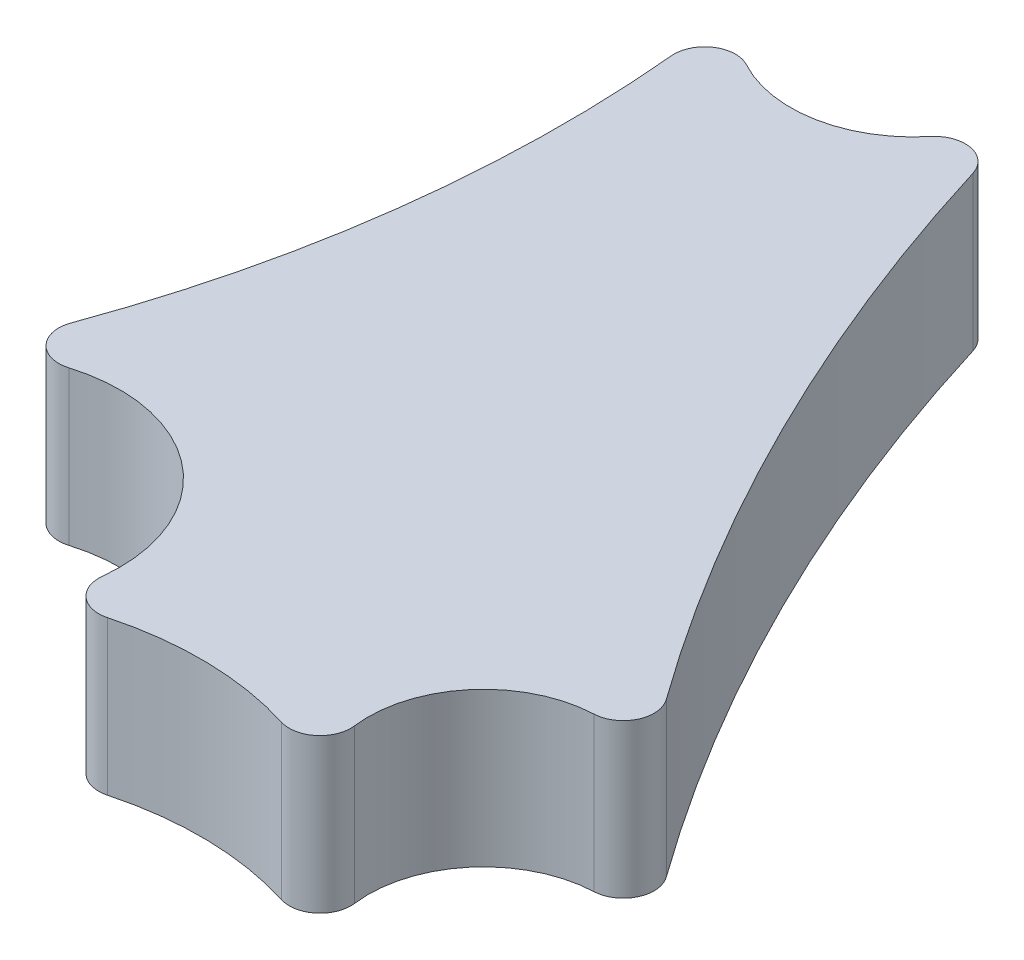
ISO-10303-21;
HEADER;
FILE_DESCRIPTION(('STEP AP214'),'2;1');
FILE_NAME('part.step','',(''),(''),'','','');
FILE_SCHEMA(('AUTOMOTIVE_DESIGN { 1 0 10303 214 1 1 1 1 }'));
ENDSEC;
DATA;
#1=APPLICATION_CONTEXT('core data for automotive mechanical design processes');
#2=APPLICATION_PROTOCOL_DEFINITION('international standard','automotive_design',2000,#1);
#3=PRODUCT_CONTEXT('',#1,'mechanical');
#4=PRODUCT('Part','Part','',(#3));
#5=PRODUCT_RELATED_PRODUCT_CATEGORY('part','',(#4));
#6=PRODUCT_DEFINITION_FORMATION('','',#4);
#7=PRODUCT_DEFINITION_CONTEXT('part definition',#1,'design');
#8=PRODUCT_DEFINITION('design','',#6,#7);
#9=PRODUCT_DEFINITION_SHAPE('','',#8);
#10=(LENGTH_UNIT() NAMED_UNIT(*) SI_UNIT(.MILLI.,.METRE.));
#11=(NAMED_UNIT(*) PLANE_ANGLE_UNIT() SI_UNIT($,.RADIAN.));
#12=(NAMED_UNIT(*) SI_UNIT($,.STERADIAN.) SOLID_ANGLE_UNIT());
#13=UNCERTAINTY_MEASURE_WITH_UNIT(LENGTH_MEASURE(1.E-05),#10,'distance_accuracy_value','');
#14=(GEOMETRIC_REPRESENTATION_CONTEXT(3) GLOBAL_UNCERTAINTY_ASSIGNED_CONTEXT((#13)) GLOBAL_UNIT_ASSIGNED_CONTEXT((#10,
#11,#12)) REPRESENTATION_CONTEXT('',''));
#15=CARTESIAN_POINT('',(0.,0.,0.));
#16=DIRECTION('',(0.,0.,1.));
#17=DIRECTION('',(1.,0.,0.));
#18=AXIS2_PLACEMENT_3D('',#15,#16,#17);
#19=CARTESIAN_POINT('',(0.,12.7,0.));
#20=DIRECTION('',(0.,-1.,0.));
#21=DIRECTION('',(0.,0.,-1.));
#22=AXIS2_PLACEMENT_3D('',#19,#20,#21);
#23=CYLINDRICAL_SURFACE('',#22,12.7);
#24=CARTESIAN_POINT('',(0.,0.,0.));
#25=DIRECTION('',(0.,1.,0.));
#26=DIRECTION('',(0.,0.,1.));
#27=AXIS2_PLACEMENT_3D('',#24,#25,#26);
#28=CIRCLE('',#27,12.7);
#29=CARTESIAN_POINT('',(12.6249154529566,0.,1.37895243054242));
#30=VERTEX_POINT('',#29);
#31=CARTESIAN_POINT('',(-3.66399168199355,0.,-12.1599821115938));
#32=VERTEX_POINT('',#31);
#33=EDGE_CURVE('E261',#30,#32,#28,.T.);
#34=ORIENTED_EDGE('',*,*,#33,.F.);
#35=DIRECTION('',(0.,-1.,0.));
#36=VECTOR('',#35,1.);
#37=CARTESIAN_POINT('',(12.6249154529566,12.7,1.37895243054242));
#38=LINE('',#37,#36);
#39=CARTESIAN_POINT('',(12.6249154529566,12.7,1.37895243054242));
#40=VERTEX_POINT('',#39);
#41=EDGE_CURVE('E223',#30,#40,#38,.F.);
#42=ORIENTED_EDGE('',*,*,#41,.T.);
#43=CARTESIAN_POINT('',(0.,12.7,0.));
#44=DIRECTION('',(0.,1.,0.));
#45=DIRECTION('',(0.,0.,1.));
#46=AXIS2_PLACEMENT_3D('',#43,#44,#45);
#47=CIRCLE('',#46,12.7);
#48=CARTESIAN_POINT('',(-3.66399168199355,12.7,-12.1599821115938));
#49=VERTEX_POINT('',#48);
#50=EDGE_CURVE('E247',#40,#49,#47,.T.);
#51=ORIENTED_EDGE('',*,*,#50,.T.);
#52=DIRECTION('',(0.,-1.,0.));
#53=VECTOR('',#52,1.);
#54=CARTESIAN_POINT('',(-3.66399168199355,12.7,-12.1599821115938));
#55=LINE('',#54,#53);
#56=EDGE_CURVE('E219',#49,#32,#55,.T.);
#57=ORIENTED_EDGE('',*,*,#56,.T.);
#58=EDGE_LOOP('',(#34,#42,#51,#57));
#59=FACE_BOUND('',#58,.T.);
#60=ADVANCED_FACE('F45',(#59),#23,.F.);
#61=CARTESIAN_POINT('',(22.6244146613143,12.7,29.4960252978468));
#62=DIRECTION('',(0.,-1.,0.));
#63=DIRECTION('',(0.,0.,-1.));
#64=AXIS2_PLACEMENT_3D('',#61,#62,#63);
#65=CYLINDRICAL_SURFACE('',#64,26.2871642001818);
#66=CARTESIAN_POINT('',(22.6244146613143,0.,29.4960252978468));
#67=DIRECTION('',(0.,1.,0.));
#68=DIRECTION('',(0.,0.,1.));
#69=AXIS2_PLACEMENT_3D('',#66,#67,#68);
#70=CIRCLE('',#69,26.2871642001818);
#71=CARTESIAN_POINT('',(15.8084881574027,0.,4.10787555075827));
#72=VERTEX_POINT('',#71);
#73=CARTESIAN_POINT('',(30.4546315760282,0.,4.40214746368483));
#74=VERTEX_POINT('',#73);
#75=EDGE_CURVE('E257',#72,#74,#70,.F.);
#76=ORIENTED_EDGE('',*,*,#75,.T.);
#77=DIRECTION('',(0.,-1.,0.));
#78=VECTOR('',#77,1.);
#79=CARTESIAN_POINT('',(30.4546315760282,12.7,4.40214746368483));
#80=LINE('',#79,#78);
#81=CARTESIAN_POINT('',(30.4546315760282,12.7,4.40214746368483));
#82=VERTEX_POINT('',#81);
#83=EDGE_CURVE('E216',#74,#82,#80,.F.);
#84=ORIENTED_EDGE('',*,*,#83,.T.);
#85=CARTESIAN_POINT('',(22.6244146613143,12.7,29.4960252978468));
#86=DIRECTION('',(0.,1.,0.));
#87=DIRECTION('',(0.,0.,1.));
#88=AXIS2_PLACEMENT_3D('',#85,#86,#87);
#89=CIRCLE('',#88,26.2871642001818);
#90=CARTESIAN_POINT('',(15.8084881574027,12.7,4.10787555075827));
#91=VERTEX_POINT('',#90);
#92=EDGE_CURVE('E251',#91,#82,#89,.F.);
#93=ORIENTED_EDGE('',*,*,#92,.F.);
#94=DIRECTION('',(0.,-1.,0.));
#95=VECTOR('',#94,1.);
#96=CARTESIAN_POINT('',(15.8084881574027,12.7,4.10787555075827));
#97=LINE('',#96,#95);
#98=EDGE_CURVE('E212',#91,#72,#97,.T.);
#99=ORIENTED_EDGE('',*,*,#98,.T.);
#100=EDGE_LOOP('',(#76,#84,#93,#99));
#101=FACE_BOUND('',#100,.T.);
#102=ADVANCED_FACE('F301',(#101),#65,.F.);
#103=CARTESIAN_POINT('',(43.17776617003,12.7,0.439213576989693));
#104=DIRECTION('',(0.,-1.,0.));
#105=DIRECTION('',(0.,0.,-1.));
#106=AXIS2_PLACEMENT_3D('',#103,#104,#105);
#107=CYLINDRICAL_SURFACE('',#106,9.525);
#108=CARTESIAN_POINT('',(43.17776617003,0.,0.439213576989693));
#109=DIRECTION('',(0.,1.,0.));
#110=DIRECTION('',(0.,0.,1.));
#111=AXIS2_PLACEMENT_3D('',#108,#109,#110);
#112=CIRCLE('',#111,9.525);
#113=CARTESIAN_POINT('',(42.7706018601452,0.,-9.07707993596776));
#114=VERTEX_POINT('',#113);
#115=CARTESIAN_POINT('',(33.7304984889186,0.,1.65360987203841));
#116=VERTEX_POINT('',#115);
#117=EDGE_CURVE('E159',#114,#116,#112,.T.);
#118=ORIENTED_EDGE('',*,*,#117,.F.);
#119=DIRECTION('',(0.,-1.,0.));
#120=VECTOR('',#119,1.);
#121=CARTESIAN_POINT('',(42.7706018601452,12.7,-9.07707993596776));
#122=LINE('',#121,#120);
#123=CARTESIAN_POINT('',(42.7706018601452,12.7,-9.07707993596776));
#124=VERTEX_POINT('',#123);
#125=EDGE_CURVE('E193',#114,#124,#122,.F.);
#126=ORIENTED_EDGE('',*,*,#125,.T.);
#127=CARTESIAN_POINT('',(43.17776617003,12.7,0.439213576989693));
#128=DIRECTION('',(0.,1.,0.));
#129=DIRECTION('',(0.,0.,1.));
#130=AXIS2_PLACEMENT_3D('',#127,#128,#129);
#131=CIRCLE('',#130,9.525);
#132=CARTESIAN_POINT('',(33.7304984889186,12.7,1.65360987203841));
#133=VERTEX_POINT('',#132);
#134=EDGE_CURVE('E266',#124,#133,#131,.T.);
#135=ORIENTED_EDGE('',*,*,#134,.T.);
#136=DIRECTION('',(0.,-1.,0.));
#137=VECTOR('',#136,1.);
#138=CARTESIAN_POINT('',(33.7304984889186,12.7,1.65360987203841));
#139=LINE('',#138,#137);
#140=EDGE_CURVE('E189',#133,#116,#139,.T.);
#141=ORIENTED_EDGE('',*,*,#140,.T.);
#142=EDGE_LOOP('',(#118,#126,#135,#141));
#143=FACE_BOUND('',#142,.T.);
#144=ADVANCED_FACE('F284',(#143),#107,.F.);
#145=CARTESIAN_POINT('',(185.337668109277,12.7,-114.271004748885));
#146=DIRECTION('',(0.,-1.,0.));
#147=DIRECTION('',(0.,0.,-1.));
#148=AXIS2_PLACEMENT_3D('',#145,#146,#147);
#149=CYLINDRICAL_SURFACE('',#148,173.228723535823);
#150=CARTESIAN_POINT('',(185.337668109277,12.7,-114.271004748885));
#151=DIRECTION('',(0.,1.,0.));
#152=DIRECTION('',(0.,0.,1.));
#153=AXIS2_PLACEMENT_3D('',#150,#151,#152);
#154=CIRCLE('',#153,173.228723535823);
#155=CARTESIAN_POINT('',(19.7472026490004,12.7,-63.3987293279911));
#156=VERTEX_POINT('',#155);
#157=CARTESIAN_POINT('',(44.7238029779993,12.7,-13.0982238703641));
#158=VERTEX_POINT('',#157);
#159=EDGE_CURVE('E240',#156,#158,#154,.T.);
#160=ORIENTED_EDGE('',*,*,#159,.T.);
#161=DIRECTION('',(0.,-1.,0.));
#162=VECTOR('',#161,1.);
#163=CARTESIAN_POINT('',(44.7238029779993,12.7,-13.0982238703641));
#164=LINE('',#163,#162);
#165=CARTESIAN_POINT('',(44.7238029779993,0.,-13.0982238703641));
#166=VERTEX_POINT('',#165);
#167=EDGE_CURVE('E157',#158,#166,#164,.T.);
#168=ORIENTED_EDGE('',*,*,#167,.T.);
#169=CARTESIAN_POINT('',(185.337668109277,0.,-114.271004748885));
#170=DIRECTION('',(0.,1.,0.));
#171=DIRECTION('',(0.,0.,1.));
#172=AXIS2_PLACEMENT_3D('',#169,#170,#171);
#173=CIRCLE('',#172,173.228723535823);
#174=CARTESIAN_POINT('',(19.7472026490004,0.,-63.3987293279911));
#175=VERTEX_POINT('',#174);
#176=EDGE_CURVE('E140',#175,#166,#173,.T.);
#177=ORIENTED_EDGE('',*,*,#176,.F.);
#178=DIRECTION('',(0.,-1.,0.));
#179=VECTOR('',#178,1.);
#180=CARTESIAN_POINT('',(19.7472026490003,12.7,-63.3987293279911));
#181=LINE('',#180,#179);
#182=EDGE_CURVE('E154',#175,#156,#181,.F.);
#183=ORIENTED_EDGE('',*,*,#182,.T.);
#184=EDGE_LOOP('',(#160,#168,#177,#183));
#185=FACE_BOUND('',#184,.T.);
#186=ADVANCED_FACE('F153',(#185),#149,.F.);
#187=CARTESIAN_POINT('',(7.51226764546583,12.7,-70.7221339809743));
#188=DIRECTION('',(0.,-1.,0.));
#189=DIRECTION('',(0.,0.,-1.));
#190=AXIS2_PLACEMENT_3D('',#187,#188,#189);
#191=CYLINDRICAL_SURFACE('',#190,10.16);
#192=CARTESIAN_POINT('',(7.51226764546583,12.7,-70.7221339809743));
#193=DIRECTION('',(0.,1.,0.));
#194=DIRECTION('',(0.,0.,1.));
#195=AXIS2_PLACEMENT_3D('',#192,#193,#194);
#196=CIRCLE('',#195,10.16);
#197=CARTESIAN_POINT('',(2.64259877608588,12.7,-61.8051880294396));
#198=VERTEX_POINT('',#197);
#199=CARTESIAN_POINT('',(15.3578136092592,12.7,-64.2666705173642));
#200=VERTEX_POINT('',#199);
#201=EDGE_CURVE('E170',#198,#200,#196,.T.);
#202=ORIENTED_EDGE('',*,*,#201,.T.);
#203=DIRECTION('',(0.,-1.,0.));
#204=VECTOR('',#203,1.);
#205=CARTESIAN_POINT('',(15.3578136092592,12.7,-64.2666705173642));
#206=LINE('',#205,#204);
#207=CARTESIAN_POINT('',(15.3578136092592,0.,-64.2666705173642));
#208=VERTEX_POINT('',#207);
#209=EDGE_CURVE('E11',#200,#208,#206,.T.);
#210=ORIENTED_EDGE('',*,*,#209,.T.);
#211=CARTESIAN_POINT('',(7.51226764546583,0.,-70.7221339809743));
#212=DIRECTION('',(0.,1.,0.));
#213=DIRECTION('',(0.,0.,1.));
#214=AXIS2_PLACEMENT_3D('',#211,#212,#213);
#215=CIRCLE('',#214,10.16);
#216=CARTESIAN_POINT('',(2.64259877608588,0.,-61.8051880294396));
#217=VERTEX_POINT('',#216);
#218=EDGE_CURVE('E142',#217,#208,#215,.T.);
#219=ORIENTED_EDGE('',*,*,#218,.F.);
#220=DIRECTION('',(0.,-1.,0.));
#221=VECTOR('',#220,1.);
#222=CARTESIAN_POINT('',(2.64259877608588,12.7,-61.8051880294396));
#223=LINE('',#222,#221);
#224=EDGE_CURVE('E54',#217,#198,#223,.F.);
#225=ORIENTED_EDGE('',*,*,#224,.T.);
#226=EDGE_LOOP('',(#202,#210,#219,#225));
#227=FACE_BOUND('',#226,.T.);
#228=ADVANCED_FACE('F235',(#227),#191,.F.);
#229=CARTESIAN_POINT('',(-101.316289244449,12.7,-50.0043499532195));
#230=DIRECTION('',(0.,-1.,0.));
#231=DIRECTION('',(0.,0.,-1.));
#232=AXIS2_PLACEMENT_3D('',#229,#230,#231);
#233=CYLINDRICAL_SURFACE('',#232,100.646362372983);
#234=CARTESIAN_POINT('',(-101.316289244449,0.,-50.0043499532195));
#235=DIRECTION('',(0.,1.,0.));
#236=DIRECTION('',(0.,0.,1.));
#237=AXIS2_PLACEMENT_3D('',#234,#235,#236);
#238=CIRCLE('',#237,100.646362372983);
#239=CARTESIAN_POINT('',(-1.10386714342012,0.,-59.3403402894943));
#240=VERTEX_POINT('',#239);
#241=CARTESIAN_POINT('',(-6.78252707097238,0.,-15.4636772868923));
#242=VERTEX_POINT('',#241);
#243=EDGE_CURVE('E173',#240,#242,#238,.F.);
#244=ORIENTED_EDGE('',*,*,#243,.T.);
#245=DIRECTION('',(0.,-1.,0.));
#246=VECTOR('',#245,1.);
#247=CARTESIAN_POINT('',(-6.78252707097238,12.7,-15.4636772868923));
#248=LINE('',#247,#246);
#249=CARTESIAN_POINT('',(-6.78252707097238,12.7,-15.4636772868923));
#250=VERTEX_POINT('',#249);
#251=EDGE_CURVE('E61',#242,#250,#248,.F.);
#252=ORIENTED_EDGE('',*,*,#251,.T.);
#253=CARTESIAN_POINT('',(-101.316289244449,12.7,-50.0043499532195));
#254=DIRECTION('',(0.,1.,0.));
#255=DIRECTION('',(0.,0.,1.));
#256=AXIS2_PLACEMENT_3D('',#253,#254,#255);
#257=CIRCLE('',#256,100.646362372983);
#258=CARTESIAN_POINT('',(-1.10386714342012,12.7,-59.3403402894943));
#259=VERTEX_POINT('',#258);
#260=EDGE_CURVE('E165',#259,#250,#257,.F.);
#261=ORIENTED_EDGE('',*,*,#260,.F.);
#262=DIRECTION('',(0.,-1.,0.));
#263=VECTOR('',#262,1.);
#264=CARTESIAN_POINT('',(-1.10386714342012,12.7,-59.3403402894943));
#265=LINE('',#264,#263);
#266=EDGE_CURVE('E226',#259,#240,#265,.T.);
#267=ORIENTED_EDGE('',*,*,#266,.T.);
#268=EDGE_LOOP('',(#244,#252,#261,#267));
#269=FACE_BOUND('',#268,.T.);
#270=ADVANCED_FACE('F244',(#269),#233,.F.);
#271=CARTESIAN_POINT('',(0.,12.7,0.));
#272=DIRECTION('',(0.,1.,0.));
#273=DIRECTION('',(0.,0.,1.));
#274=AXIS2_PLACEMENT_3D('',#271,#272,#273);
#275=PLANE('',#274);
#276=ORIENTED_EDGE('',*,*,#134,.F.);
#277=CARTESIAN_POINT('',(42.6620247108426,12.7,-11.6147582060899));
#278=DIRECTION('',(0.,1.,0.));
#279=DIRECTION('',(0.,0.,1.));
#280=AXIS2_PLACEMENT_3D('',#277,#278,#279);
#281=CIRCLE('',#280,2.54);
#282=EDGE_CURVE('E209',#124,#158,#281,.T.);
#283=ORIENTED_EDGE('',*,*,#282,.T.);
#284=ORIENTED_EDGE('',*,*,#159,.F.);
#285=CARTESIAN_POINT('',(17.3192001002076,12.7,-62.6528046514617));
#286=DIRECTION('',(0.,1.,0.));
#287=DIRECTION('',(0.,0.,1.));
#288=AXIS2_PLACEMENT_3D('',#285,#286,#287);
#289=CIRCLE('',#288,2.54);
#290=EDGE_CURVE('E163',#156,#200,#289,.T.);
#291=ORIENTED_EDGE('',*,*,#290,.T.);
#292=ORIENTED_EDGE('',*,*,#201,.F.);
#293=CARTESIAN_POINT('',(1.42518155874083,12.7,-59.5759515415558));
#294=DIRECTION('',(0.,1.,0.));
#295=DIRECTION('',(0.,0.,1.));
#296=AXIS2_PLACEMENT_3D('',#293,#294,#295);
#297=CIRCLE('',#296,2.54);
#298=EDGE_CURVE('E68',#198,#259,#297,.T.);
#299=ORIENTED_EDGE('',*,*,#298,.T.);
#300=ORIENTED_EDGE('',*,*,#260,.T.);
#301=CARTESIAN_POINT('',(-4.39679001839226,12.7,-14.5919785339126));
#302=DIRECTION('',(0.,1.,0.));
#303=DIRECTION('',(0.,0.,1.));
#304=AXIS2_PLACEMENT_3D('',#301,#302,#303);
#305=CIRCLE('',#304,2.54);
#306=EDGE_CURVE('E200',#250,#49,#305,.T.);
#307=ORIENTED_EDGE('',*,*,#306,.T.);
#308=ORIENTED_EDGE('',*,*,#50,.F.);
#309=CARTESIAN_POINT('',(15.1498985435479,12.7,1.6547429166509));
#310=DIRECTION('',(0.,1.,0.));
#311=DIRECTION('',(0.,0.,1.));
#312=AXIS2_PLACEMENT_3D('',#309,#310,#311);
#313=CIRCLE('',#312,2.54);
#314=EDGE_CURVE('E203',#40,#91,#313,.T.);
#315=ORIENTED_EDGE('',*,*,#314,.T.);
#316=ORIENTED_EDGE('',*,*,#92,.T.);
#317=CARTESIAN_POINT('',(31.2112271072889,12.7,1.9774488840514));
#318=DIRECTION('',(0.,1.,0.));
#319=DIRECTION('',(0.,0.,1.));
#320=AXIS2_PLACEMENT_3D('',#317,#318,#319);
#321=CIRCLE('',#320,2.54);
#322=EDGE_CURVE('E206',#82,#133,#321,.T.);
#323=ORIENTED_EDGE('',*,*,#322,.T.);
#324=EDGE_LOOP('',(#276,#283,#284,#291,#292,#299,#300,#307,#308,#315,#316,#323));
#325=FACE_BOUND('',#324,.T.);
#326=ADVANCED_FACE('F238',(#325),#275,.T.);
#327=CARTESIAN_POINT('',(0.,0.,0.));
#328=DIRECTION('',(0.,1.,0.));
#329=DIRECTION('',(0.,0.,1.));
#330=AXIS2_PLACEMENT_3D('',#327,#328,#329);
#331=PLANE('',#330);
#332=ORIENTED_EDGE('',*,*,#176,.T.);
#333=CARTESIAN_POINT('',(42.6620247108426,0.,-11.6147582060899));
#334=DIRECTION('',(0.,1.,0.));
#335=DIRECTION('',(0.,0.,1.));
#336=AXIS2_PLACEMENT_3D('',#333,#334,#335);
#337=CIRCLE('',#336,2.54);
#338=EDGE_CURVE('E186',#166,#114,#337,.F.);
#339=ORIENTED_EDGE('',*,*,#338,.T.);
#340=ORIENTED_EDGE('',*,*,#117,.T.);
#341=CARTESIAN_POINT('',(31.2112271072889,0.,1.9774488840514));
#342=DIRECTION('',(0.,1.,0.));
#343=DIRECTION('',(0.,0.,1.));
#344=AXIS2_PLACEMENT_3D('',#341,#342,#343);
#345=CIRCLE('',#344,2.54);
#346=EDGE_CURVE('E183',#116,#74,#345,.F.);
#347=ORIENTED_EDGE('',*,*,#346,.T.);
#348=ORIENTED_EDGE('',*,*,#75,.F.);
#349=CARTESIAN_POINT('',(15.1498985435479,0.,1.6547429166509));
#350=DIRECTION('',(0.,1.,0.));
#351=DIRECTION('',(0.,0.,1.));
#352=AXIS2_PLACEMENT_3D('',#349,#350,#351);
#353=CIRCLE('',#352,2.54);
#354=EDGE_CURVE('E180',#72,#30,#353,.F.);
#355=ORIENTED_EDGE('',*,*,#354,.T.);
#356=ORIENTED_EDGE('',*,*,#33,.T.);
#357=CARTESIAN_POINT('',(-4.39679001839226,0.,-14.5919785339126));
#358=DIRECTION('',(0.,1.,0.));
#359=DIRECTION('',(0.,0.,1.));
#360=AXIS2_PLACEMENT_3D('',#357,#358,#359);
#361=CIRCLE('',#360,2.54);
#362=EDGE_CURVE('E147',#32,#242,#361,.F.);
#363=ORIENTED_EDGE('',*,*,#362,.T.);
#364=ORIENTED_EDGE('',*,*,#243,.F.);
#365=CARTESIAN_POINT('',(1.42518155874083,0.,-59.5759515415558));
#366=DIRECTION('',(0.,1.,0.));
#367=DIRECTION('',(0.,0.,1.));
#368=AXIS2_PLACEMENT_3D('',#365,#366,#367);
#369=CIRCLE('',#368,2.54);
#370=EDGE_CURVE('E148',#240,#217,#369,.F.);
#371=ORIENTED_EDGE('',*,*,#370,.T.);
#372=ORIENTED_EDGE('',*,*,#218,.T.);
#373=CARTESIAN_POINT('',(17.3192001002076,0.,-62.6528046514617));
#374=DIRECTION('',(0.,1.,0.));
#375=DIRECTION('',(0.,0.,1.));
#376=AXIS2_PLACEMENT_3D('',#373,#374,#375);
#377=CIRCLE('',#376,2.54);
#378=EDGE_CURVE('E137',#208,#175,#377,.F.);
#379=ORIENTED_EDGE('',*,*,#378,.T.);
#380=EDGE_LOOP('',(#332,#339,#340,#347,#348,#355,#356,#363,#364,#371,#372,#379));
#381=FACE_BOUND('',#380,.T.);
#382=ADVANCED_FACE('F139',(#381),#331,.F.);
#383=CARTESIAN_POINT('',(42.6620247108426,12.7,-11.6147582060899));
#384=DIRECTION('',(0.,-1.,0.));
#385=DIRECTION('',(0.,0.,-1.));
#386=AXIS2_PLACEMENT_3D('',#383,#384,#385);
#387=CYLINDRICAL_SURFACE('',#386,2.54);
#388=ORIENTED_EDGE('',*,*,#282,.F.);
#389=ORIENTED_EDGE('',*,*,#125,.F.);
#390=ORIENTED_EDGE('',*,*,#338,.F.);
#391=ORIENTED_EDGE('',*,*,#167,.F.);
#392=EDGE_LOOP('',(#388,#389,#390,#391));
#393=FACE_BOUND('',#392,.T.);
#394=ADVANCED_FACE('F289',(#393),#387,.T.);
#395=CARTESIAN_POINT('',(31.2112271072889,12.7,1.9774488840514));
#396=DIRECTION('',(0.,-1.,0.));
#397=DIRECTION('',(0.,0.,-1.));
#398=AXIS2_PLACEMENT_3D('',#395,#396,#397);
#399=CYLINDRICAL_SURFACE('',#398,2.54);
#400=ORIENTED_EDGE('',*,*,#322,.F.);
#401=ORIENTED_EDGE('',*,*,#83,.F.);
#402=ORIENTED_EDGE('',*,*,#346,.F.);
#403=ORIENTED_EDGE('',*,*,#140,.F.);
#404=EDGE_LOOP('',(#400,#401,#402,#403));
#405=FACE_BOUND('',#404,.T.);
#406=ADVANCED_FACE('F281',(#405),#399,.T.);
#407=CARTESIAN_POINT('',(15.1498985435479,12.7,1.6547429166509));
#408=DIRECTION('',(0.,-1.,0.));
#409=DIRECTION('',(0.,0.,-1.));
#410=AXIS2_PLACEMENT_3D('',#407,#408,#409);
#411=CYLINDRICAL_SURFACE('',#410,2.54);
#412=ORIENTED_EDGE('',*,*,#314,.F.);
#413=ORIENTED_EDGE('',*,*,#41,.F.);
#414=ORIENTED_EDGE('',*,*,#354,.F.);
#415=ORIENTED_EDGE('',*,*,#98,.F.);
#416=EDGE_LOOP('',(#412,#413,#414,#415));
#417=FACE_BOUND('',#416,.T.);
#418=ADVANCED_FACE('F296',(#417),#411,.T.);
#419=CARTESIAN_POINT('',(-4.39679001839226,12.7,-14.5919785339126));
#420=DIRECTION('',(0.,-1.,0.));
#421=DIRECTION('',(0.,0.,-1.));
#422=AXIS2_PLACEMENT_3D('',#419,#420,#421);
#423=CYLINDRICAL_SURFACE('',#422,2.54);
#424=ORIENTED_EDGE('',*,*,#306,.F.);
#425=ORIENTED_EDGE('',*,*,#251,.F.);
#426=ORIENTED_EDGE('',*,*,#362,.F.);
#427=ORIENTED_EDGE('',*,*,#56,.F.);
#428=EDGE_LOOP('',(#424,#425,#426,#427));
#429=FACE_BOUND('',#428,.T.);
#430=ADVANCED_FACE('F348',(#429),#423,.T.);
#431=CARTESIAN_POINT('',(17.3192001002076,12.7,-62.6528046514617));
#432=DIRECTION('',(0.,-1.,0.));
#433=DIRECTION('',(0.,0.,-1.));
#434=AXIS2_PLACEMENT_3D('',#431,#432,#433);
#435=CYLINDRICAL_SURFACE('',#434,2.54);
#436=ORIENTED_EDGE('',*,*,#290,.F.);
#437=ORIENTED_EDGE('',*,*,#182,.F.);
#438=ORIENTED_EDGE('',*,*,#378,.F.);
#439=ORIENTED_EDGE('',*,*,#209,.F.);
#440=EDGE_LOOP('',(#436,#437,#438,#439));
#441=FACE_BOUND('',#440,.T.);
#442=ADVANCED_FACE('F162',(#441),#435,.T.);
#443=CARTESIAN_POINT('',(1.42518155874083,12.7,-59.5759515415558));
#444=DIRECTION('',(0.,-1.,0.));
#445=DIRECTION('',(0.,0.,-1.));
#446=AXIS2_PLACEMENT_3D('',#443,#444,#445);
#447=CYLINDRICAL_SURFACE('',#446,2.54);
#448=ORIENTED_EDGE('',*,*,#298,.F.);
#449=ORIENTED_EDGE('',*,*,#224,.F.);
#450=ORIENTED_EDGE('',*,*,#370,.F.);
#451=ORIENTED_EDGE('',*,*,#266,.F.);
#452=EDGE_LOOP('',(#448,#449,#450,#451));
#453=FACE_BOUND('',#452,.T.);
#454=ADVANCED_FACE('F47',(#453),#447,.T.);
#455=CLOSED_SHELL('',(#60,#102,#144,#186,#228,#270,#326,#382,#394,#406,#418,#430,#442,#454));
#456=MANIFOLD_SOLID_BREP('B2',#455);
#457=ADVANCED_BREP_SHAPE_REPRESENTATION('',(#18,#456),#14);
#458=SHAPE_DEFINITION_REPRESENTATION(#9,#457);
ENDSEC;
END-ISO-10303-21;
